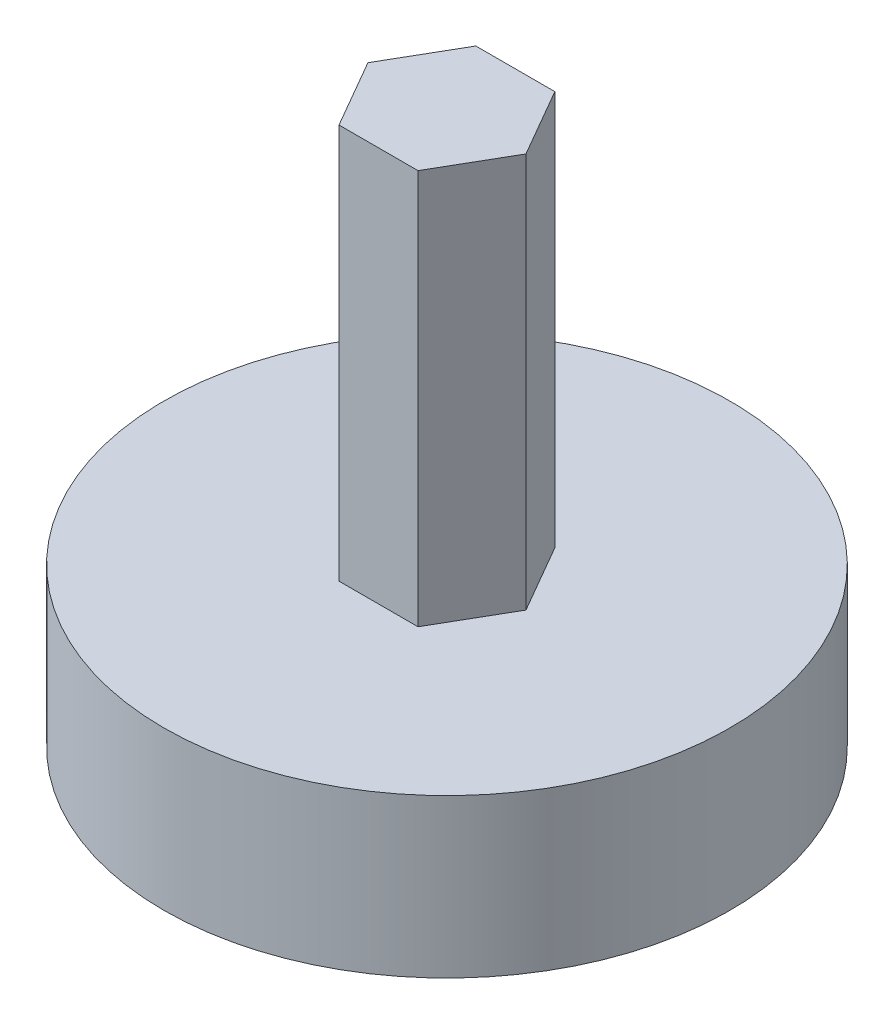
ISO-10303-21;
HEADER;
FILE_DESCRIPTION(('STEP AP214'),'2;1');
FILE_NAME('part.step','',(''),(''),'','','');
FILE_SCHEMA(('AUTOMOTIVE_DESIGN { 1 0 10303 214 1 1 1 1 }'));
ENDSEC;
DATA;
#1=APPLICATION_CONTEXT('core data for automotive mechanical design processes');
#2=APPLICATION_PROTOCOL_DEFINITION('international standard','automotive_design',2000,#1);
#3=PRODUCT_CONTEXT('',#1,'mechanical');
#4=PRODUCT('Part','Part','',(#3));
#5=PRODUCT_RELATED_PRODUCT_CATEGORY('part','',(#4));
#6=PRODUCT_DEFINITION_FORMATION('','',#4);
#7=PRODUCT_DEFINITION_CONTEXT('part definition',#1,'design');
#8=PRODUCT_DEFINITION('design','',#6,#7);
#9=PRODUCT_DEFINITION_SHAPE('','',#8);
#10=(LENGTH_UNIT() NAMED_UNIT(*) SI_UNIT(.MILLI.,.METRE.));
#11=(NAMED_UNIT(*) PLANE_ANGLE_UNIT() SI_UNIT($,.RADIAN.));
#12=(NAMED_UNIT(*) SI_UNIT($,.STERADIAN.) SOLID_ANGLE_UNIT());
#13=UNCERTAINTY_MEASURE_WITH_UNIT(LENGTH_MEASURE(1.E-05),#10,'distance_accuracy_value','');
#14=(GEOMETRIC_REPRESENTATION_CONTEXT(3) GLOBAL_UNCERTAINTY_ASSIGNED_CONTEXT((#13)) GLOBAL_UNIT_ASSIGNED_CONTEXT((#10,
#11,#12)) REPRESENTATION_CONTEXT('',''));
#15=CARTESIAN_POINT('',(0.,0.,0.));
#16=DIRECTION('',(0.,0.,1.));
#17=DIRECTION('',(1.,0.,0.));
#18=AXIS2_PLACEMENT_3D('',#15,#16,#17);
#19=CARTESIAN_POINT('',(0.,6.,0.));
#20=DIRECTION('',(0.,-1.,0.));
#21=DIRECTION('',(0.,0.,-1.));
#22=AXIS2_PLACEMENT_3D('',#19,#20,#21);
#23=CYLINDRICAL_SURFACE('',#22,10.75);
#24=CARTESIAN_POINT('',(0.,6.,0.));
#25=DIRECTION('',(0.,1.,0.));
#26=DIRECTION('',(0.,0.,1.));
#27=AXIS2_PLACEMENT_3D('',#24,#25,#26);
#28=CIRCLE('',#27,10.75);
#29=CARTESIAN_POINT('',(0.,6.,10.75));
#30=VERTEX_POINT('',#29);
#31=EDGE_CURVE('E11',#30,#30,#28,.T.);
#32=ORIENTED_EDGE('',*,*,#31,.F.);
#33=EDGE_LOOP('',(#32));
#34=FACE_BOUND('',#33,.T.);
#35=CARTESIAN_POINT('',(0.,0.,0.));
#36=DIRECTION('',(0.,1.,0.));
#37=DIRECTION('',(0.,0.,1.));
#38=AXIS2_PLACEMENT_3D('',#35,#36,#37);
#39=CIRCLE('',#38,10.75);
#40=CARTESIAN_POINT('',(0.,0.,10.75));
#41=VERTEX_POINT('',#40);
#42=EDGE_CURVE('E46',#41,#41,#39,.T.);
#43=ORIENTED_EDGE('',*,*,#42,.T.);
#44=EDGE_LOOP('',(#43));
#45=FACE_BOUND('',#44,.T.);
#46=ADVANCED_FACE('F43',(#34,#45),#23,.T.);
#47=CARTESIAN_POINT('',(0.,6.,0.));
#48=DIRECTION('',(0.,1.,0.));
#49=DIRECTION('',(0.,0.,1.));
#50=AXIS2_PLACEMENT_3D('',#47,#48,#49);
#51=PLANE('',#50);
#52=DIRECTION('',(0.5,0.,-0.866025403784439));
#53=VECTOR('',#52,1.);
#54=CARTESIAN_POINT('',(1.5,6.,2.59807621135332));
#55=LINE('',#54,#53);
#56=CARTESIAN_POINT('',(1.5,6.,2.59807621135332));
#57=VERTEX_POINT('',#56);
#58=CARTESIAN_POINT('',(3.,6.,0.));
#59=VERTEX_POINT('',#58);
#60=EDGE_CURVE('E58',#57,#59,#55,.T.);
#61=ORIENTED_EDGE('',*,*,#60,.F.);
#62=DIRECTION('',(1.,0.,0.));
#63=VECTOR('',#62,1.);
#64=CARTESIAN_POINT('',(-1.5,6.,2.59807621135332));
#65=LINE('',#64,#63);
#66=CARTESIAN_POINT('',(-1.5,6.,2.59807621135332));
#67=VERTEX_POINT('',#66);
#68=EDGE_CURVE('E62',#67,#57,#65,.T.);
#69=ORIENTED_EDGE('',*,*,#68,.F.);
#70=DIRECTION('',(0.5,0.,0.866025403784438));
#71=VECTOR('',#70,1.);
#72=CARTESIAN_POINT('',(-3.,6.,0.));
#73=LINE('',#72,#71);
#74=CARTESIAN_POINT('',(-3.,6.,0.));
#75=VERTEX_POINT('',#74);
#76=EDGE_CURVE('E142',#75,#67,#73,.T.);
#77=ORIENTED_EDGE('',*,*,#76,.F.);
#78=DIRECTION('',(-0.5,0.,0.866025403784439));
#79=VECTOR('',#78,1.);
#80=CARTESIAN_POINT('',(-1.5,6.,-2.59807621135332));
#81=LINE('',#80,#79);
#82=CARTESIAN_POINT('',(-1.5,6.,-2.59807621135332));
#83=VERTEX_POINT('',#82);
#84=EDGE_CURVE('E145',#83,#75,#81,.T.);
#85=ORIENTED_EDGE('',*,*,#84,.F.);
#86=DIRECTION('',(-1.,0.,0.));
#87=VECTOR('',#86,1.);
#88=CARTESIAN_POINT('',(1.5,6.,-2.59807621135332));
#89=LINE('',#88,#87);
#90=CARTESIAN_POINT('',(1.5,6.,-2.59807621135332));
#91=VERTEX_POINT('',#90);
#92=EDGE_CURVE('E149',#91,#83,#89,.T.);
#93=ORIENTED_EDGE('',*,*,#92,.F.);
#94=DIRECTION('',(-0.5,0.,-0.866025403784439));
#95=VECTOR('',#94,1.);
#96=CARTESIAN_POINT('',(3.,6.,0.));
#97=LINE('',#96,#95);
#98=EDGE_CURVE('E153',#59,#91,#97,.T.);
#99=ORIENTED_EDGE('',*,*,#98,.F.);
#100=EDGE_LOOP('',(#61,#69,#77,#85,#93,#99));
#101=FACE_BOUND('',#100,.T.);
#102=ORIENTED_EDGE('',*,*,#31,.T.);
#103=EDGE_LOOP('',(#102));
#104=FACE_BOUND('',#103,.T.);
#105=ADVANCED_FACE('F189',(#101,#104),#51,.T.);
#106=CARTESIAN_POINT('',(0.,0.,0.));
#107=DIRECTION('',(0.,1.,0.));
#108=DIRECTION('',(0.,0.,1.));
#109=AXIS2_PLACEMENT_3D('',#106,#107,#108);
#110=PLANE('',#109);
#111=ORIENTED_EDGE('',*,*,#42,.F.);
#112=EDGE_LOOP('',(#111));
#113=FACE_BOUND('',#112,.T.);
#114=ADVANCED_FACE('F194',(#113),#110,.F.);
#115=CARTESIAN_POINT('',(1.5,21.,2.59807621135332));
#116=DIRECTION('',(-0.866025403784439,0.,-0.5));
#117=DIRECTION('',(-0.5,0.,0.866025403784439));
#118=AXIS2_PLACEMENT_3D('',#115,#116,#117);
#119=PLANE('',#118);
#120=ORIENTED_EDGE('',*,*,#60,.T.);
#121=DIRECTION('',(0.,-1.,0.));
#122=VECTOR('',#121,1.);
#123=CARTESIAN_POINT('',(3.,21.,0.));
#124=LINE('',#123,#122);
#125=CARTESIAN_POINT('',(3.,21.,0.));
#126=VERTEX_POINT('',#125);
#127=EDGE_CURVE('E99',#126,#59,#124,.T.);
#128=ORIENTED_EDGE('',*,*,#127,.F.);
#129=DIRECTION('',(0.5,0.,-0.866025403784439));
#130=VECTOR('',#129,1.);
#131=CARTESIAN_POINT('',(1.5,21.,2.59807621135332));
#132=LINE('',#131,#130);
#133=CARTESIAN_POINT('',(1.5,21.,2.59807621135332));
#134=VERTEX_POINT('',#133);
#135=EDGE_CURVE('E106',#134,#126,#132,.T.);
#136=ORIENTED_EDGE('',*,*,#135,.F.);
#137=DIRECTION('',(0.,-1.,0.));
#138=VECTOR('',#137,1.);
#139=CARTESIAN_POINT('',(1.5,21.,2.59807621135332));
#140=LINE('',#139,#138);
#141=EDGE_CURVE('E137',#134,#57,#140,.T.);
#142=ORIENTED_EDGE('',*,*,#141,.T.);
#143=EDGE_LOOP('',(#120,#128,#136,#142));
#144=FACE_BOUND('',#143,.T.);
#145=ADVANCED_FACE('F117',(#144),#119,.F.);
#146=CARTESIAN_POINT('',(3.,21.,0.));
#147=DIRECTION('',(-0.866025403784439,0.,0.5));
#148=DIRECTION('',(0.5,0.,0.866025403784439));
#149=AXIS2_PLACEMENT_3D('',#146,#147,#148);
#150=PLANE('',#149);
#151=ORIENTED_EDGE('',*,*,#98,.T.);
#152=DIRECTION('',(0.,-1.,0.));
#153=VECTOR('',#152,1.);
#154=CARTESIAN_POINT('',(1.5,21.,-2.59807621135332));
#155=LINE('',#154,#153);
#156=CARTESIAN_POINT('',(1.5,21.,-2.59807621135332));
#157=VERTEX_POINT('',#156);
#158=EDGE_CURVE('E101',#157,#91,#155,.T.);
#159=ORIENTED_EDGE('',*,*,#158,.F.);
#160=DIRECTION('',(-0.5,0.,-0.866025403784439));
#161=VECTOR('',#160,1.);
#162=CARTESIAN_POINT('',(3.,21.,0.));
#163=LINE('',#162,#161);
#164=EDGE_CURVE('E94',#126,#157,#163,.T.);
#165=ORIENTED_EDGE('',*,*,#164,.F.);
#166=ORIENTED_EDGE('',*,*,#127,.T.);
#167=EDGE_LOOP('',(#151,#159,#165,#166));
#168=FACE_BOUND('',#167,.T.);
#169=ADVANCED_FACE('F97',(#168),#150,.F.);
#170=CARTESIAN_POINT('',(1.5,21.,-2.59807621135332));
#171=DIRECTION('',(0.,0.,1.));
#172=DIRECTION('',(1.,0.,0.));
#173=AXIS2_PLACEMENT_3D('',#170,#171,#172);
#174=PLANE('',#173);
#175=ORIENTED_EDGE('',*,*,#92,.T.);
#176=DIRECTION('',(0.,-1.,0.));
#177=VECTOR('',#176,1.);
#178=CARTESIAN_POINT('',(-1.5,21.,-2.59807621135332));
#179=LINE('',#178,#177);
#180=CARTESIAN_POINT('',(-1.5,21.,-2.59807621135332));
#181=VERTEX_POINT('',#180);
#182=EDGE_CURVE('E123',#181,#83,#179,.T.);
#183=ORIENTED_EDGE('',*,*,#182,.F.);
#184=DIRECTION('',(-1.,0.,0.));
#185=VECTOR('',#184,1.);
#186=CARTESIAN_POINT('',(1.5,21.,-2.59807621135332));
#187=LINE('',#186,#185);
#188=EDGE_CURVE('E105',#157,#181,#187,.T.);
#189=ORIENTED_EDGE('',*,*,#188,.F.);
#190=ORIENTED_EDGE('',*,*,#158,.T.);
#191=EDGE_LOOP('',(#175,#183,#189,#190));
#192=FACE_BOUND('',#191,.T.);
#193=ADVANCED_FACE('F171',(#192),#174,.F.);
#194=CARTESIAN_POINT('',(-1.5,21.,-2.59807621135332));
#195=DIRECTION('',(0.866025403784439,0.,0.5));
#196=DIRECTION('',(0.5,0.,-0.866025403784439));
#197=AXIS2_PLACEMENT_3D('',#194,#195,#196);
#198=PLANE('',#197);
#199=ORIENTED_EDGE('',*,*,#84,.T.);
#200=DIRECTION('',(0.,-1.,0.));
#201=VECTOR('',#200,1.);
#202=CARTESIAN_POINT('',(-3.,21.,0.));
#203=LINE('',#202,#201);
#204=CARTESIAN_POINT('',(-3.,21.,0.));
#205=VERTEX_POINT('',#204);
#206=EDGE_CURVE('E129',#205,#75,#203,.T.);
#207=ORIENTED_EDGE('',*,*,#206,.F.);
#208=DIRECTION('',(-0.5,0.,0.866025403784439));
#209=VECTOR('',#208,1.);
#210=CARTESIAN_POINT('',(-1.5,21.,-2.59807621135332));
#211=LINE('',#210,#209);
#212=EDGE_CURVE('E163',#181,#205,#211,.T.);
#213=ORIENTED_EDGE('',*,*,#212,.F.);
#214=ORIENTED_EDGE('',*,*,#182,.T.);
#215=EDGE_LOOP('',(#199,#207,#213,#214));
#216=FACE_BOUND('',#215,.T.);
#217=ADVANCED_FACE('F173',(#216),#198,.F.);
#218=CARTESIAN_POINT('',(-3.,21.,0.));
#219=DIRECTION('',(0.866025403784438,0.,-0.5));
#220=DIRECTION('',(-0.5,0.,-0.866025403784439));
#221=AXIS2_PLACEMENT_3D('',#218,#219,#220);
#222=PLANE('',#221);
#223=ORIENTED_EDGE('',*,*,#76,.T.);
#224=DIRECTION('',(0.,-1.,0.));
#225=VECTOR('',#224,1.);
#226=CARTESIAN_POINT('',(-1.5,21.,2.59807621135332));
#227=LINE('',#226,#225);
#228=CARTESIAN_POINT('',(-1.5,21.,2.59807621135332));
#229=VERTEX_POINT('',#228);
#230=EDGE_CURVE('E133',#229,#67,#227,.T.);
#231=ORIENTED_EDGE('',*,*,#230,.F.);
#232=DIRECTION('',(0.5,0.,0.866025403784438));
#233=VECTOR('',#232,1.);
#234=CARTESIAN_POINT('',(-3.,21.,0.));
#235=LINE('',#234,#233);
#236=EDGE_CURVE('E160',#205,#229,#235,.T.);
#237=ORIENTED_EDGE('',*,*,#236,.F.);
#238=ORIENTED_EDGE('',*,*,#206,.T.);
#239=EDGE_LOOP('',(#223,#231,#237,#238));
#240=FACE_BOUND('',#239,.T.);
#241=ADVANCED_FACE('F177',(#240),#222,.F.);
#242=CARTESIAN_POINT('',(-1.5,21.,2.59807621135332));
#243=DIRECTION('',(0.,0.,-1.));
#244=DIRECTION('',(-1.,0.,0.));
#245=AXIS2_PLACEMENT_3D('',#242,#243,#244);
#246=PLANE('',#245);
#247=ORIENTED_EDGE('',*,*,#68,.T.);
#248=ORIENTED_EDGE('',*,*,#141,.F.);
#249=DIRECTION('',(1.,0.,0.));
#250=VECTOR('',#249,1.);
#251=CARTESIAN_POINT('',(-1.5,21.,2.59807621135332));
#252=LINE('',#251,#250);
#253=EDGE_CURVE('E111',#229,#134,#252,.T.);
#254=ORIENTED_EDGE('',*,*,#253,.F.);
#255=ORIENTED_EDGE('',*,*,#230,.T.);
#256=EDGE_LOOP('',(#247,#248,#254,#255));
#257=FACE_BOUND('',#256,.T.);
#258=ADVANCED_FACE('F179',(#257),#246,.F.);
#259=CARTESIAN_POINT('',(0.,21.,0.));
#260=DIRECTION('',(0.,1.,0.));
#261=DIRECTION('',(0.,0.,1.));
#262=AXIS2_PLACEMENT_3D('',#259,#260,#261);
#263=PLANE('',#262);
#264=ORIENTED_EDGE('',*,*,#135,.T.);
#265=ORIENTED_EDGE('',*,*,#164,.T.);
#266=ORIENTED_EDGE('',*,*,#188,.T.);
#267=ORIENTED_EDGE('',*,*,#212,.T.);
#268=ORIENTED_EDGE('',*,*,#236,.T.);
#269=ORIENTED_EDGE('',*,*,#253,.T.);
#270=EDGE_LOOP('',(#264,#265,#266,#267,#268,#269));
#271=FACE_BOUND('',#270,.T.);
#272=ADVANCED_FACE('F109',(#271),#263,.T.);
#273=CLOSED_SHELL('',(#46,#105,#114,#145,#169,#193,#217,#241,#258,#272));
#274=MANIFOLD_SOLID_BREP('B2',#273);
#275=ADVANCED_BREP_SHAPE_REPRESENTATION('',(#18,#274),#14);
#276=SHAPE_DEFINITION_REPRESENTATION(#9,#275);
ENDSEC;
END-ISO-10303-21;
